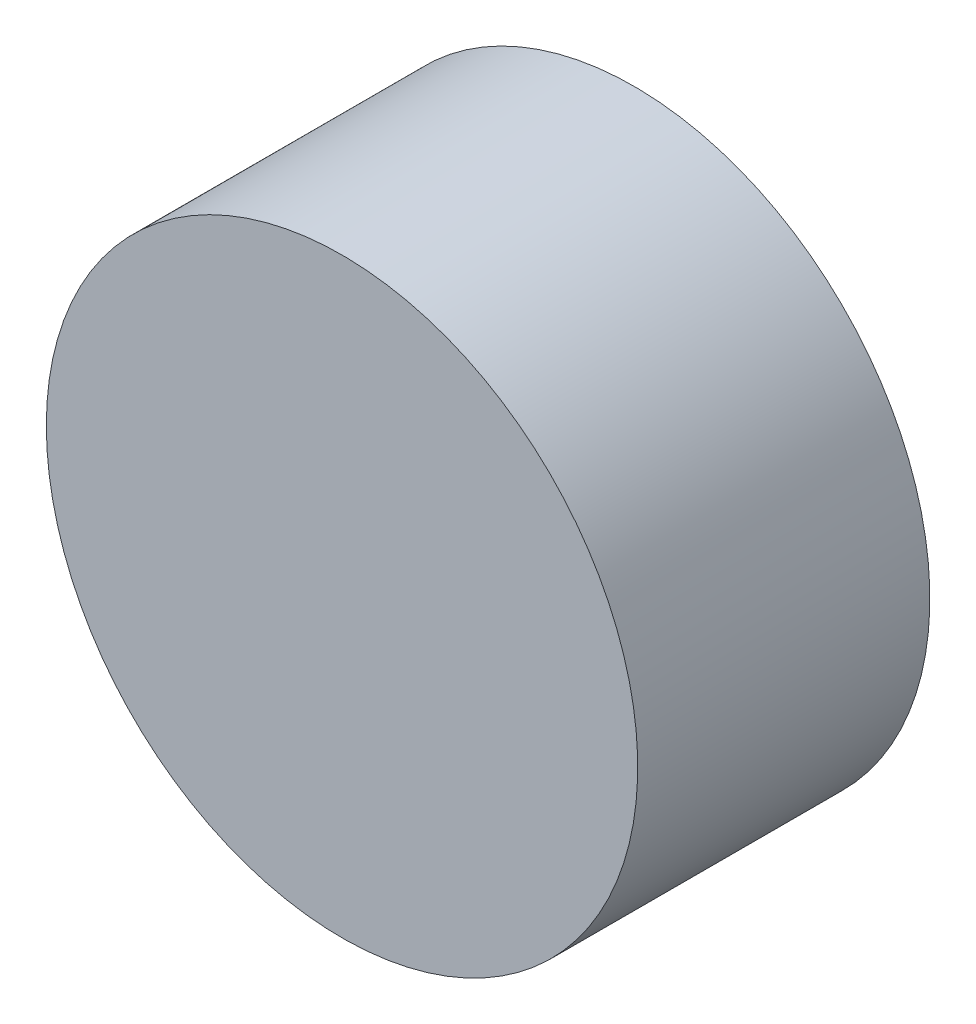
ISO-10303-21;
HEADER;
FILE_DESCRIPTION(('STEP AP214'),'2;1');
FILE_NAME('part.step','',(''),(''),'','','');
FILE_SCHEMA(('AUTOMOTIVE_DESIGN { 1 0 10303 214 1 1 1 1 }'));
ENDSEC;
DATA;
#1=APPLICATION_CONTEXT('core data for automotive mechanical design processes');
#2=APPLICATION_PROTOCOL_DEFINITION('international standard','automotive_design',2000,#1);
#3=PRODUCT_CONTEXT('',#1,'mechanical');
#4=PRODUCT('Part','Part','',(#3));
#5=PRODUCT_RELATED_PRODUCT_CATEGORY('part','',(#4));
#6=PRODUCT_DEFINITION_FORMATION('','',#4);
#7=PRODUCT_DEFINITION_CONTEXT('part definition',#1,'design');
#8=PRODUCT_DEFINITION('design','',#6,#7);
#9=PRODUCT_DEFINITION_SHAPE('','',#8);
#10=(LENGTH_UNIT() NAMED_UNIT(*) SI_UNIT(.MILLI.,.METRE.));
#11=(NAMED_UNIT(*) PLANE_ANGLE_UNIT() SI_UNIT($,.RADIAN.));
#12=(NAMED_UNIT(*) SI_UNIT($,.STERADIAN.) SOLID_ANGLE_UNIT());
#13=UNCERTAINTY_MEASURE_WITH_UNIT(LENGTH_MEASURE(1.E-05),#10,'distance_accuracy_value','');
#14=(GEOMETRIC_REPRESENTATION_CONTEXT(3) GLOBAL_UNCERTAINTY_ASSIGNED_CONTEXT((#13)) GLOBAL_UNIT_ASSIGNED_CONTEXT((#10,
#11,#12)) REPRESENTATION_CONTEXT('',''));
#15=CARTESIAN_POINT('',(0.,0.,0.));
#16=DIRECTION('',(0.,0.,1.));
#17=DIRECTION('',(1.,0.,0.));
#18=AXIS2_PLACEMENT_3D('',#15,#16,#17);
#19=CARTESIAN_POINT('',(0.,0.,10.));
#20=DIRECTION('',(0.,0.,-1.));
#21=DIRECTION('',(-1.,0.,0.));
#22=AXIS2_PLACEMENT_3D('',#19,#20,#21);
#23=CYLINDRICAL_SURFACE('',#22,10.1234567891235);
#24=CARTESIAN_POINT('',(0.,0.,10.));
#25=DIRECTION('',(0.,0.,-1.));
#26=DIRECTION('',(-1.,0.,0.));
#27=AXIS2_PLACEMENT_3D('',#24,#25,#26);
#28=CIRCLE('',#27,10.1234567891235);
#29=CARTESIAN_POINT('',(-10.1234567891235,0.,10.));
#30=VERTEX_POINT('',#29);
#31=EDGE_CURVE('E10',#30,#30,#28,.T.);
#32=ORIENTED_EDGE('',*,*,#31,.T.);
#33=EDGE_LOOP('',(#32));
#34=FACE_BOUND('',#33,.T.);
#35=CARTESIAN_POINT('',(0.,0.,0.));
#36=DIRECTION('',(0.,0.,-1.));
#37=DIRECTION('',(-1.,0.,0.));
#38=AXIS2_PLACEMENT_3D('',#35,#36,#37);
#39=CIRCLE('',#38,10.1234567891235);
#40=CARTESIAN_POINT('',(-10.1234567891235,0.,0.));
#41=VERTEX_POINT('',#40);
#42=EDGE_CURVE('E37',#41,#41,#39,.T.);
#43=ORIENTED_EDGE('',*,*,#42,.F.);
#44=EDGE_LOOP('',(#43));
#45=FACE_BOUND('',#44,.T.);
#46=ADVANCED_FACE('F31',(#34,#45),#23,.T.);
#47=CARTESIAN_POINT('',(10.1234567891235,0.,10.));
#48=DIRECTION('',(0.,0.,1.));
#49=DIRECTION('',(1.,0.,0.));
#50=AXIS2_PLACEMENT_3D('',#47,#48,#49);
#51=PLANE('',#50);
#52=ORIENTED_EDGE('',*,*,#31,.F.);
#53=EDGE_LOOP('',(#52));
#54=FACE_BOUND('',#53,.T.);
#55=ADVANCED_FACE('F46',(#54),#51,.T.);
#56=CARTESIAN_POINT('',(0.,0.,0.));
#57=DIRECTION('',(0.,0.,-1.));
#58=DIRECTION('',(-1.,0.,0.));
#59=AXIS2_PLACEMENT_3D('',#56,#57,#58);
#60=PLANE('',#59);
#61=ORIENTED_EDGE('',*,*,#42,.T.);
#62=EDGE_LOOP('',(#61));
#63=FACE_BOUND('',#62,.T.);
#64=ADVANCED_FACE('F43',(#63),#60,.T.);
#65=CLOSED_SHELL('',(#46,#55,#64));
#66=MANIFOLD_SOLID_BREP('B2',#65);
#67=ADVANCED_BREP_SHAPE_REPRESENTATION('',(#18,#66),#14);
#68=SHAPE_DEFINITION_REPRESENTATION(#9,#67);
ENDSEC;
END-ISO-10303-21;
